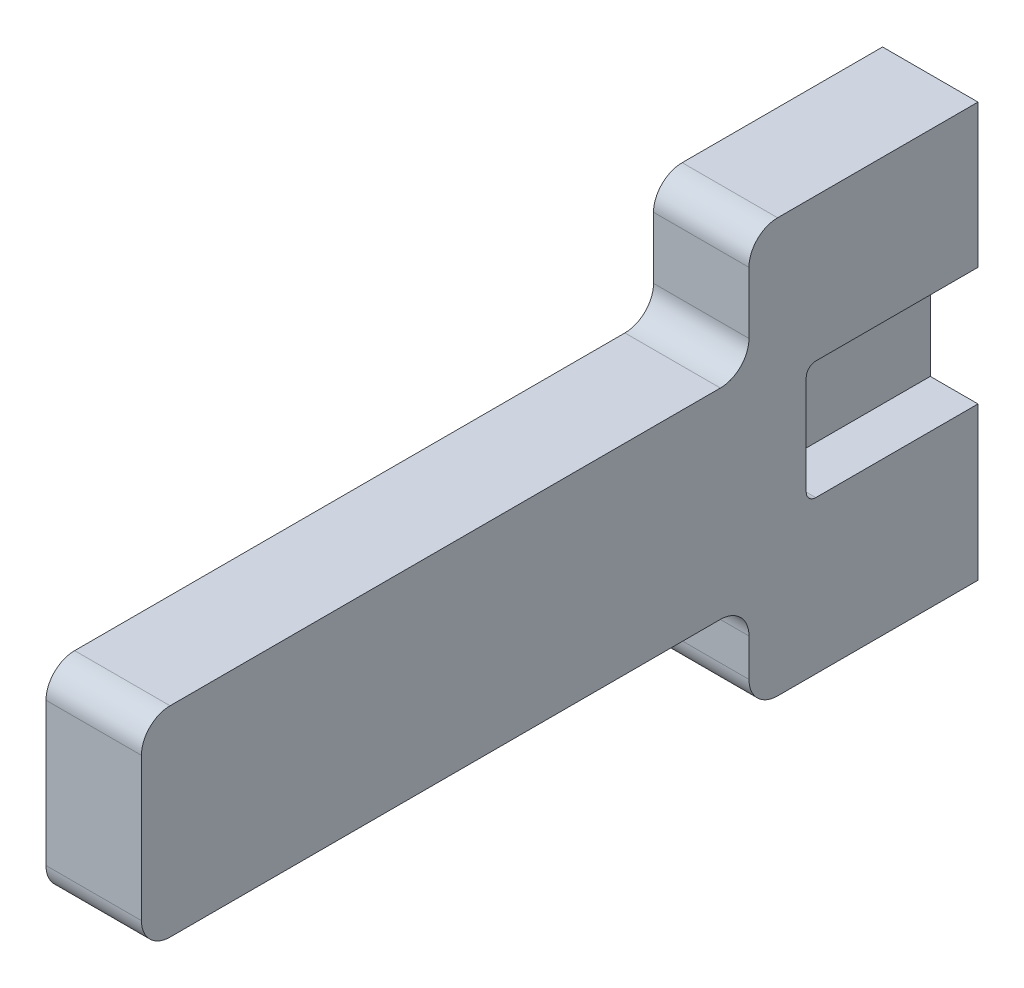
ISO-10303-21;
HEADER;
FILE_DESCRIPTION(('STEP AP214'),'2;1');
FILE_NAME('part.step','',(''),(''),'','','');
FILE_SCHEMA(('AUTOMOTIVE_DESIGN { 1 0 10303 214 1 1 1 1 }'));
ENDSEC;
DATA;
#1=APPLICATION_CONTEXT('core data for automotive mechanical design processes');
#2=APPLICATION_PROTOCOL_DEFINITION('international standard','automotive_design',2000,#1);
#3=PRODUCT_CONTEXT('',#1,'mechanical');
#4=PRODUCT('Part','Part','',(#3));
#5=PRODUCT_RELATED_PRODUCT_CATEGORY('part','',(#4));
#6=PRODUCT_DEFINITION_FORMATION('','',#4);
#7=PRODUCT_DEFINITION_CONTEXT('part definition',#1,'design');
#8=PRODUCT_DEFINITION('design','',#6,#7);
#9=PRODUCT_DEFINITION_SHAPE('','',#8);
#10=(LENGTH_UNIT() NAMED_UNIT(*) SI_UNIT(.MILLI.,.METRE.));
#11=(NAMED_UNIT(*) PLANE_ANGLE_UNIT() SI_UNIT($,.RADIAN.));
#12=(NAMED_UNIT(*) SI_UNIT($,.STERADIAN.) SOLID_ANGLE_UNIT());
#13=UNCERTAINTY_MEASURE_WITH_UNIT(LENGTH_MEASURE(1.E-05),#10,'distance_accuracy_value','');
#14=(GEOMETRIC_REPRESENTATION_CONTEXT(3) GLOBAL_UNCERTAINTY_ASSIGNED_CONTEXT((#13)) GLOBAL_UNIT_ASSIGNED_CONTEXT((#10,
#11,#12)) REPRESENTATION_CONTEXT('',''));
#15=CARTESIAN_POINT('',(0.,0.,0.));
#16=DIRECTION('',(0.,0.,1.));
#17=DIRECTION('',(1.,0.,0.));
#18=AXIS2_PLACEMENT_3D('',#15,#16,#17);
#19=CARTESIAN_POINT('',(10.,-10.2165086349905,0.));
#20=DIRECTION('',(0.,0.,1.));
#21=DIRECTION('',(1.,0.,0.));
#22=AXIS2_PLACEMENT_3D('',#19,#20,#21);
#23=PLANE('',#22);
#24=DIRECTION('',(0.,1.,0.));
#25=VECTOR('',#24,1.);
#26=CARTESIAN_POINT('',(5.,12.394708994709,0.));
#27=LINE('',#26,#25);
#28=CARTESIAN_POINT('',(5.,0.,0.));
#29=VERTEX_POINT('',#28);
#30=CARTESIAN_POINT('',(5.,12.394708994709,0.));
#31=VERTEX_POINT('',#30);
#32=EDGE_CURVE('E184',#29,#31,#27,.T.);
#33=ORIENTED_EDGE('',*,*,#32,.F.);
#34=DIRECTION('',(1.,0.,0.));
#35=VECTOR('',#34,1.);
#36=CARTESIAN_POINT('',(5.,0.,0.));
#37=LINE('',#36,#35);
#38=CARTESIAN_POINT('',(10.,0.,0.));
#39=VERTEX_POINT('',#38);
#40=EDGE_CURVE('E199',#29,#39,#37,.T.);
#41=ORIENTED_EDGE('',*,*,#40,.T.);
#42=DIRECTION('',(0.,1.,0.));
#43=VECTOR('',#42,1.);
#44=CARTESIAN_POINT('',(10.,-16.0028498087904,0.));
#45=LINE('',#44,#43);
#46=CARTESIAN_POINT('',(10.,-16.0028498087904,0.));
#47=VERTEX_POINT('',#46);
#48=EDGE_CURVE('E206',#47,#39,#45,.T.);
#49=ORIENTED_EDGE('',*,*,#48,.F.);
#50=DIRECTION('',(-1.,0.,0.));
#51=VECTOR('',#50,1.);
#52=CARTESIAN_POINT('',(10.,-16.0028498087904,0.));
#53=LINE('',#52,#51);
#54=CARTESIAN_POINT('',(0.,-16.0028498087904,0.));
#55=VERTEX_POINT('',#54);
#56=EDGE_CURVE('E227',#47,#55,#53,.T.);
#57=ORIENTED_EDGE('',*,*,#56,.T.);
#58=DIRECTION('',(0.,1.,0.));
#59=VECTOR('',#58,1.);
#60=CARTESIAN_POINT('',(0.,-10.2165086349905,0.));
#61=LINE('',#60,#59);
#62=CARTESIAN_POINT('',(0.,27.394708994709,0.));
#63=VERTEX_POINT('',#62);
#64=EDGE_CURVE('E201',#55,#63,#61,.T.);
#65=ORIENTED_EDGE('',*,*,#64,.T.);
#66=DIRECTION('',(-1.,0.,0.));
#67=VECTOR('',#66,1.);
#68=CARTESIAN_POINT('',(10.,27.394708994709,0.));
#69=LINE('',#68,#67);
#70=CARTESIAN_POINT('',(10.,27.394708994709,0.));
#71=VERTEX_POINT('',#70);
#72=EDGE_CURVE('E249',#71,#63,#69,.T.);
#73=ORIENTED_EDGE('',*,*,#72,.F.);
#74=CARTESIAN_POINT('',(10.,12.394708994709,0.));
#75=VERTEX_POINT('',#74);
#76=EDGE_CURVE('E198',#75,#71,#45,.T.);
#77=ORIENTED_EDGE('',*,*,#76,.F.);
#78=DIRECTION('',(1.,0.,0.));
#79=VECTOR('',#78,1.);
#80=CARTESIAN_POINT('',(5.,12.394708994709,0.));
#81=LINE('',#80,#79);
#82=EDGE_CURVE('E180',#31,#75,#81,.T.);
#83=ORIENTED_EDGE('',*,*,#82,.F.);
#84=EDGE_LOOP('',(#33,#41,#49,#57,#65,#73,#77,#83));
#85=FACE_BOUND('',#84,.T.);
#86=ADVANCED_FACE('F43',(#85),#23,.F.);
#87=CARTESIAN_POINT('',(10.,27.394708994709,0.));
#88=DIRECTION('',(0.,-1.,0.));
#89=DIRECTION('',(0.,0.,-1.));
#90=AXIS2_PLACEMENT_3D('',#87,#88,#89);
#91=PLANE('',#90);
#92=DIRECTION('',(0.,0.,1.));
#93=VECTOR('',#92,1.);
#94=CARTESIAN_POINT('',(0.,27.394708994709,0.));
#95=LINE('',#94,#93);
#96=CARTESIAN_POINT('',(0.,27.394708994709,21.));
#97=VERTEX_POINT('',#96);
#98=EDGE_CURVE('E229',#63,#97,#95,.T.);
#99=ORIENTED_EDGE('',*,*,#98,.T.);
#100=DIRECTION('',(-1.,0.,0.));
#101=VECTOR('',#100,1.);
#102=CARTESIAN_POINT('',(10.,27.394708994709,21.));
#103=LINE('',#102,#101);
#104=CARTESIAN_POINT('',(10.,27.394708994709,21.));
#105=VERTEX_POINT('',#104);
#106=EDGE_CURVE('E298',#97,#105,#103,.F.);
#107=ORIENTED_EDGE('',*,*,#106,.T.);
#108=DIRECTION('',(0.,0.,1.));
#109=VECTOR('',#108,1.);
#110=CARTESIAN_POINT('',(10.,27.394708994709,0.));
#111=LINE('',#110,#109);
#112=EDGE_CURVE('E209',#71,#105,#111,.T.);
#113=ORIENTED_EDGE('',*,*,#112,.F.);
#114=ORIENTED_EDGE('',*,*,#72,.T.);
#115=EDGE_LOOP('',(#99,#107,#113,#114));
#116=FACE_BOUND('',#115,.T.);
#117=ADVANCED_FACE('F352',(#116),#91,.F.);
#118=CARTESIAN_POINT('',(10.,27.394708994709,24.));
#119=DIRECTION('',(0.,0.,-1.));
#120=DIRECTION('',(0.,1.,0.));
#121=AXIS2_PLACEMENT_3D('',#118,#119,#120);
#122=PLANE('',#121);
#123=DIRECTION('',(0.,-1.,0.));
#124=VECTOR('',#123,1.);
#125=CARTESIAN_POINT('',(10.,27.394708994709,24.));
#126=LINE('',#125,#124);
#127=CARTESIAN_POINT('',(10.,24.394708994709,24.));
#128=VERTEX_POINT('',#127);
#129=CARTESIAN_POINT('',(10.,17.9424240836782,24.));
#130=VERTEX_POINT('',#129);
#131=EDGE_CURVE('E212',#128,#130,#126,.T.);
#132=ORIENTED_EDGE('',*,*,#131,.F.);
#133=DIRECTION('',(-1.,0.,0.));
#134=VECTOR('',#133,1.);
#135=CARTESIAN_POINT('',(10.,24.394708994709,24.));
#136=LINE('',#135,#134);
#137=CARTESIAN_POINT('',(0.,24.394708994709,24.));
#138=VERTEX_POINT('',#137);
#139=EDGE_CURVE('E295',#128,#138,#136,.T.);
#140=ORIENTED_EDGE('',*,*,#139,.T.);
#141=DIRECTION('',(0.,-1.,0.));
#142=VECTOR('',#141,1.);
#143=CARTESIAN_POINT('',(0.,27.394708994709,24.));
#144=LINE('',#143,#142);
#145=CARTESIAN_POINT('',(0.,17.9424240836782,24.));
#146=VERTEX_POINT('',#145);
#147=EDGE_CURVE('E232',#138,#146,#144,.T.);
#148=ORIENTED_EDGE('',*,*,#147,.T.);
#149=DIRECTION('',(-1.,0.,0.));
#150=VECTOR('',#149,1.);
#151=CARTESIAN_POINT('',(10.,17.9424240836782,24.));
#152=LINE('',#151,#150);
#153=EDGE_CURVE('E261',#146,#130,#152,.F.);
#154=ORIENTED_EDGE('',*,*,#153,.T.);
#155=EDGE_LOOP('',(#132,#140,#148,#154));
#156=FACE_BOUND('',#155,.T.);
#157=ADVANCED_FACE('F362',(#156),#122,.F.);
#158=CARTESIAN_POINT('',(10.,14.9424240836782,24.));
#159=DIRECTION('',(0.,-1.,0.));
#160=DIRECTION('',(0.,0.,-1.));
#161=AXIS2_PLACEMENT_3D('',#158,#159,#160);
#162=PLANE('',#161);
#163=DIRECTION('',(0.,0.,1.));
#164=VECTOR('',#163,1.);
#165=CARTESIAN_POINT('',(0.,14.9424240836782,24.));
#166=LINE('',#165,#164);
#167=CARTESIAN_POINT('',(0.,14.9424240836782,27.));
#168=VERTEX_POINT('',#167);
#169=CARTESIAN_POINT('',(0.,14.9424240836782,84.6638189462944));
#170=VERTEX_POINT('',#169);
#171=EDGE_CURVE('E234',#168,#170,#166,.T.);
#172=ORIENTED_EDGE('',*,*,#171,.T.);
#173=DIRECTION('',(-1.,0.,0.));
#174=VECTOR('',#173,1.);
#175=CARTESIAN_POINT('',(10.,14.9424240836782,84.6638189462944));
#176=LINE('',#175,#174);
#177=CARTESIAN_POINT('',(10.,14.9424240836782,84.6638189462944));
#178=VERTEX_POINT('',#177);
#179=EDGE_CURVE('E308',#170,#178,#176,.F.);
#180=ORIENTED_EDGE('',*,*,#179,.T.);
#181=DIRECTION('',(0.,0.,1.));
#182=VECTOR('',#181,1.);
#183=CARTESIAN_POINT('',(10.,14.9424240836782,24.));
#184=LINE('',#183,#182);
#185=CARTESIAN_POINT('',(10.,14.9424240836782,27.));
#186=VERTEX_POINT('',#185);
#187=EDGE_CURVE('E214',#186,#178,#184,.T.);
#188=ORIENTED_EDGE('',*,*,#187,.F.);
#189=DIRECTION('',(-1.,0.,0.));
#190=VECTOR('',#189,1.);
#191=CARTESIAN_POINT('',(0.,14.9424240836782,27.));
#192=LINE('',#191,#190);
#193=EDGE_CURVE('E258',#186,#168,#192,.T.);
#194=ORIENTED_EDGE('',*,*,#193,.T.);
#195=EDGE_LOOP('',(#172,#180,#188,#194));
#196=FACE_BOUND('',#195,.T.);
#197=ADVANCED_FACE('F429',(#196),#162,.F.);
#198=CARTESIAN_POINT('',(10.,14.9424240836782,87.6638189462944));
#199=DIRECTION('',(0.,0.,-1.));
#200=DIRECTION('',(-1.,0.,0.));
#201=AXIS2_PLACEMENT_3D('',#198,#199,#200);
#202=PLANE('',#201);
#203=DIRECTION('',(0.,-1.,0.));
#204=VECTOR('',#203,1.);
#205=CARTESIAN_POINT('',(0.,14.9424240836782,87.6638189462944));
#206=LINE('',#205,#204);
#207=CARTESIAN_POINT('',(0.,11.9424240836782,87.6638189462944));
#208=VERTEX_POINT('',#207);
#209=CARTESIAN_POINT('',(0.,-3.05757591632179,87.6638189462944));
#210=VERTEX_POINT('',#209);
#211=EDGE_CURVE('E237',#208,#210,#206,.T.);
#212=ORIENTED_EDGE('',*,*,#211,.T.);
#213=DIRECTION('',(-1.,0.,0.));
#214=VECTOR('',#213,1.);
#215=CARTESIAN_POINT('',(10.,-3.05757591632179,87.6638189462944));
#216=LINE('',#215,#214);
#217=CARTESIAN_POINT('',(10.,-3.05757591632179,87.6638189462944));
#218=VERTEX_POINT('',#217);
#219=EDGE_CURVE('E306',#210,#218,#216,.F.);
#220=ORIENTED_EDGE('',*,*,#219,.T.);
#221=DIRECTION('',(0.,-1.,0.));
#222=VECTOR('',#221,1.);
#223=CARTESIAN_POINT('',(10.,14.9424240836782,87.6638189462944));
#224=LINE('',#223,#222);
#225=CARTESIAN_POINT('',(10.,11.9424240836782,87.6638189462944));
#226=VERTEX_POINT('',#225);
#227=EDGE_CURVE('E217',#226,#218,#224,.T.);
#228=ORIENTED_EDGE('',*,*,#227,.F.);
#229=DIRECTION('',(-1.,0.,0.));
#230=VECTOR('',#229,1.);
#231=CARTESIAN_POINT('',(10.,11.9424240836782,87.6638189462944));
#232=LINE('',#231,#230);
#233=EDGE_CURVE('E303',#226,#208,#232,.T.);
#234=ORIENTED_EDGE('',*,*,#233,.T.);
#235=EDGE_LOOP('',(#212,#220,#228,#234));
#236=FACE_BOUND('',#235,.T.);
#237=ADVANCED_FACE('F411',(#236),#202,.F.);
#238=CARTESIAN_POINT('',(10.,-6.0575759163218,87.6638189462944));
#239=DIRECTION('',(0.,1.,0.));
#240=DIRECTION('',(0.,0.,1.));
#241=AXIS2_PLACEMENT_3D('',#238,#239,#240);
#242=PLANE('',#241);
#243=DIRECTION('',(0.,0.,-1.));
#244=VECTOR('',#243,1.);
#245=CARTESIAN_POINT('',(10.,-6.0575759163218,87.6638189462944));
#246=LINE('',#245,#244);
#247=CARTESIAN_POINT('',(10.,-6.0575759163218,84.6638189462944));
#248=VERTEX_POINT('',#247);
#249=CARTESIAN_POINT('',(10.,-6.0575759163218,27.));
#250=VERTEX_POINT('',#249);
#251=EDGE_CURVE('E220',#248,#250,#246,.T.);
#252=ORIENTED_EDGE('',*,*,#251,.F.);
#253=DIRECTION('',(-1.,0.,0.));
#254=VECTOR('',#253,1.);
#255=CARTESIAN_POINT('',(10.,-6.0575759163218,84.6638189462944));
#256=LINE('',#255,#254);
#257=CARTESIAN_POINT('',(0.,-6.0575759163218,84.6638189462944));
#258=VERTEX_POINT('',#257);
#259=EDGE_CURVE('E300',#248,#258,#256,.T.);
#260=ORIENTED_EDGE('',*,*,#259,.T.);
#261=DIRECTION('',(0.,0.,-1.));
#262=VECTOR('',#261,1.);
#263=CARTESIAN_POINT('',(0.,-6.0575759163218,87.6638189462944));
#264=LINE('',#263,#262);
#265=CARTESIAN_POINT('',(0.,-6.0575759163218,27.));
#266=VERTEX_POINT('',#265);
#267=EDGE_CURVE('E240',#258,#266,#264,.T.);
#268=ORIENTED_EDGE('',*,*,#267,.T.);
#269=DIRECTION('',(-1.,0.,0.));
#270=VECTOR('',#269,1.);
#271=CARTESIAN_POINT('',(10.,-6.0575759163218,27.));
#272=LINE('',#271,#270);
#273=EDGE_CURVE('E255',#266,#250,#272,.F.);
#274=ORIENTED_EDGE('',*,*,#273,.T.);
#275=EDGE_LOOP('',(#252,#260,#268,#274));
#276=FACE_BOUND('',#275,.T.);
#277=ADVANCED_FACE('F417',(#276),#242,.F.);
#278=CARTESIAN_POINT('',(10.,-6.0575759163218,24.));
#279=DIRECTION('',(0.,0.,-1.));
#280=DIRECTION('',(0.,1.,0.));
#281=AXIS2_PLACEMENT_3D('',#278,#279,#280);
#282=PLANE('',#281);
#283=DIRECTION('',(0.,-1.,0.));
#284=VECTOR('',#283,1.);
#285=CARTESIAN_POINT('',(0.,-6.0575759163218,24.));
#286=LINE('',#285,#284);
#287=CARTESIAN_POINT('',(0.,-9.05757591632179,24.));
#288=VERTEX_POINT('',#287);
#289=CARTESIAN_POINT('',(0.,-13.0028498087904,24.));
#290=VERTEX_POINT('',#289);
#291=EDGE_CURVE('E242',#288,#290,#286,.T.);
#292=ORIENTED_EDGE('',*,*,#291,.T.);
#293=DIRECTION('',(-1.,0.,0.));
#294=VECTOR('',#293,1.);
#295=CARTESIAN_POINT('',(10.,-13.0028498087904,24.));
#296=LINE('',#295,#294);
#297=CARTESIAN_POINT('',(10.,-13.0028498087904,24.));
#298=VERTEX_POINT('',#297);
#299=EDGE_CURVE('E285',#290,#298,#296,.F.);
#300=ORIENTED_EDGE('',*,*,#299,.T.);
#301=DIRECTION('',(0.,-1.,0.));
#302=VECTOR('',#301,1.);
#303=CARTESIAN_POINT('',(10.,-6.0575759163218,24.));
#304=LINE('',#303,#302);
#305=CARTESIAN_POINT('',(10.,-9.05757591632179,24.));
#306=VERTEX_POINT('',#305);
#307=EDGE_CURVE('E222',#306,#298,#304,.T.);
#308=ORIENTED_EDGE('',*,*,#307,.F.);
#309=DIRECTION('',(-1.,0.,0.));
#310=VECTOR('',#309,1.);
#311=CARTESIAN_POINT('',(0.,-9.05757591632179,24.));
#312=LINE('',#311,#310);
#313=EDGE_CURVE('E252',#306,#288,#312,.T.);
#314=ORIENTED_EDGE('',*,*,#313,.T.);
#315=EDGE_LOOP('',(#292,#300,#308,#314));
#316=FACE_BOUND('',#315,.T.);
#317=ADVANCED_FACE('F424',(#316),#282,.F.);
#318=CARTESIAN_POINT('',(10.,-16.0028498087904,24.));
#319=DIRECTION('',(0.,1.,0.));
#320=DIRECTION('',(0.,0.,1.));
#321=AXIS2_PLACEMENT_3D('',#318,#319,#320);
#322=PLANE('',#321);
#323=DIRECTION('',(0.,0.,-1.));
#324=VECTOR('',#323,1.);
#325=CARTESIAN_POINT('',(10.,-16.0028498087904,24.));
#326=LINE('',#325,#324);
#327=CARTESIAN_POINT('',(10.,-16.0028498087904,21.));
#328=VERTEX_POINT('',#327);
#329=EDGE_CURVE('E225',#328,#47,#326,.T.);
#330=ORIENTED_EDGE('',*,*,#329,.F.);
#331=DIRECTION('',(-1.,0.,0.));
#332=VECTOR('',#331,1.);
#333=CARTESIAN_POINT('',(10.,-16.0028498087904,21.));
#334=LINE('',#333,#332);
#335=CARTESIAN_POINT('',(0.,-16.0028498087904,21.));
#336=VERTEX_POINT('',#335);
#337=EDGE_CURVE('E274',#328,#336,#334,.T.);
#338=ORIENTED_EDGE('',*,*,#337,.T.);
#339=DIRECTION('',(0.,0.,-1.));
#340=VECTOR('',#339,1.);
#341=CARTESIAN_POINT('',(0.,-16.0028498087904,24.));
#342=LINE('',#341,#340);
#343=EDGE_CURVE('E245',#336,#55,#342,.T.);
#344=ORIENTED_EDGE('',*,*,#343,.T.);
#345=ORIENTED_EDGE('',*,*,#56,.F.);
#346=EDGE_LOOP('',(#330,#338,#344,#345));
#347=FACE_BOUND('',#346,.T.);
#348=ADVANCED_FACE('F345',(#347),#322,.F.);
#349=CARTESIAN_POINT('',(10.,0.,0.));
#350=DIRECTION('',(1.,0.,0.));
#351=DIRECTION('',(0.,0.,-1.));
#352=AXIS2_PLACEMENT_3D('',#349,#350,#351);
#353=PLANE('',#352);
#354=ORIENTED_EDGE('',*,*,#307,.T.);
#355=CARTESIAN_POINT('',(10.,-13.0028498087904,21.));
#356=DIRECTION('',(1.,0.,0.));
#357=DIRECTION('',(0.,0.,-1.));
#358=AXIS2_PLACEMENT_3D('',#355,#356,#357);
#359=CIRCLE('',#358,3.);
#360=EDGE_CURVE('E293',#298,#328,#359,.T.);
#361=ORIENTED_EDGE('',*,*,#360,.T.);
#362=ORIENTED_EDGE('',*,*,#329,.T.);
#363=ORIENTED_EDGE('',*,*,#48,.T.);
#364=DIRECTION('',(0.,0.,-1.));
#365=VECTOR('',#364,1.);
#366=CARTESIAN_POINT('',(10.,0.,0.));
#367=LINE('',#366,#365);
#368=CARTESIAN_POINT('',(10.,0.,17.));
#369=VERTEX_POINT('',#368);
#370=EDGE_CURVE('E194',#369,#39,#367,.T.);
#371=ORIENTED_EDGE('',*,*,#370,.F.);
#372=CARTESIAN_POINT('',(10.,0.999999999999998,17.));
#373=DIRECTION('',(1.,0.,0.));
#374=DIRECTION('',(0.,0.,-1.));
#375=AXIS2_PLACEMENT_3D('',#372,#373,#374);
#376=CIRCLE('',#375,1.);
#377=CARTESIAN_POINT('',(10.,0.999999999999997,18.));
#378=VERTEX_POINT('',#377);
#379=EDGE_CURVE('E51',#369,#378,#376,.F.);
#380=ORIENTED_EDGE('',*,*,#379,.T.);
#381=DIRECTION('',(0.,-1.,0.));
#382=VECTOR('',#381,1.);
#383=CARTESIAN_POINT('',(10.,0.,18.));
#384=LINE('',#383,#382);
#385=CARTESIAN_POINT('',(10.,11.394708994709,18.));
#386=VERTEX_POINT('',#385);
#387=EDGE_CURVE('E325',#386,#378,#384,.T.);
#388=ORIENTED_EDGE('',*,*,#387,.F.);
#389=CARTESIAN_POINT('',(10.,11.394708994709,17.));
#390=DIRECTION('',(1.,0.,0.));
#391=DIRECTION('',(0.,0.,-1.));
#392=AXIS2_PLACEMENT_3D('',#389,#390,#391);
#393=CIRCLE('',#392,1.);
#394=CARTESIAN_POINT('',(10.,12.394708994709,17.));
#395=VERTEX_POINT('',#394);
#396=EDGE_CURVE('E11',#386,#395,#393,.F.);
#397=ORIENTED_EDGE('',*,*,#396,.T.);
#398=DIRECTION('',(0.,0.,1.));
#399=VECTOR('',#398,1.);
#400=CARTESIAN_POINT('',(10.,12.394708994709,18.));
#401=LINE('',#400,#399);
#402=EDGE_CURVE('E333',#75,#395,#401,.T.);
#403=ORIENTED_EDGE('',*,*,#402,.F.);
#404=ORIENTED_EDGE('',*,*,#76,.T.);
#405=ORIENTED_EDGE('',*,*,#112,.T.);
#406=CARTESIAN_POINT('',(10.,24.394708994709,21.));
#407=DIRECTION('',(1.,0.,0.));
#408=DIRECTION('',(0.,0.,-1.));
#409=AXIS2_PLACEMENT_3D('',#406,#407,#408);
#410=CIRCLE('',#409,3.);
#411=EDGE_CURVE('E291',#105,#128,#410,.T.);
#412=ORIENTED_EDGE('',*,*,#411,.T.);
#413=ORIENTED_EDGE('',*,*,#131,.T.);
#414=CARTESIAN_POINT('',(10.,17.9424240836782,27.));
#415=DIRECTION('',(1.,0.,0.));
#416=DIRECTION('',(0.,0.,-1.));
#417=AXIS2_PLACEMENT_3D('',#414,#415,#416);
#418=CIRCLE('',#417,3.);
#419=EDGE_CURVE('E272',#130,#186,#418,.F.);
#420=ORIENTED_EDGE('',*,*,#419,.T.);
#421=ORIENTED_EDGE('',*,*,#187,.T.);
#422=CARTESIAN_POINT('',(10.,11.9424240836782,84.6638189462944));
#423=DIRECTION('',(1.,0.,0.));
#424=DIRECTION('',(0.,0.,-1.));
#425=AXIS2_PLACEMENT_3D('',#422,#423,#424);
#426=CIRCLE('',#425,3.);
#427=EDGE_CURVE('E287',#178,#226,#426,.T.);
#428=ORIENTED_EDGE('',*,*,#427,.T.);
#429=ORIENTED_EDGE('',*,*,#227,.T.);
#430=CARTESIAN_POINT('',(10.,-3.0575759163218,84.6638189462944));
#431=DIRECTION('',(1.,0.,0.));
#432=DIRECTION('',(0.,0.,-1.));
#433=AXIS2_PLACEMENT_3D('',#430,#431,#432);
#434=CIRCLE('',#433,3.);
#435=EDGE_CURVE('E289',#218,#248,#434,.T.);
#436=ORIENTED_EDGE('',*,*,#435,.T.);
#437=ORIENTED_EDGE('',*,*,#251,.T.);
#438=CARTESIAN_POINT('',(10.,-9.0575759163218,27.));
#439=DIRECTION('',(1.,0.,0.));
#440=DIRECTION('',(0.,0.,-1.));
#441=AXIS2_PLACEMENT_3D('',#438,#439,#440);
#442=CIRCLE('',#441,3.);
#443=EDGE_CURVE('E267',#250,#306,#442,.F.);
#444=ORIENTED_EDGE('',*,*,#443,.T.);
#445=EDGE_LOOP('',(#354,#361,#362,#363,#371,#380,#388,#397,#403,#404,#405,#412,#413,#420,#421,
#428,#429,#436,#437,#444));
#446=FACE_BOUND('',#445,.T.);
#447=ADVANCED_FACE('F324',(#446),#353,.T.);
#448=CARTESIAN_POINT('',(0.,0.,0.));
#449=DIRECTION('',(1.,0.,0.));
#450=DIRECTION('',(0.,0.,-1.));
#451=AXIS2_PLACEMENT_3D('',#448,#449,#450);
#452=PLANE('',#451);
#453=ORIENTED_EDGE('',*,*,#343,.F.);
#454=CARTESIAN_POINT('',(0.,-13.0028498087904,21.));
#455=DIRECTION('',(1.,0.,0.));
#456=DIRECTION('',(0.,0.,-1.));
#457=AXIS2_PLACEMENT_3D('',#454,#455,#456);
#458=CIRCLE('',#457,3.);
#459=EDGE_CURVE('E283',#336,#290,#458,.F.);
#460=ORIENTED_EDGE('',*,*,#459,.T.);
#461=ORIENTED_EDGE('',*,*,#291,.F.);
#462=CARTESIAN_POINT('',(0.,-9.0575759163218,27.));
#463=DIRECTION('',(1.,0.,0.));
#464=DIRECTION('',(0.,0.,-1.));
#465=AXIS2_PLACEMENT_3D('',#462,#463,#464);
#466=CIRCLE('',#465,3.);
#467=EDGE_CURVE('E264',#288,#266,#466,.T.);
#468=ORIENTED_EDGE('',*,*,#467,.T.);
#469=ORIENTED_EDGE('',*,*,#267,.F.);
#470=CARTESIAN_POINT('',(0.,-3.0575759163218,84.6638189462944));
#471=DIRECTION('',(1.,0.,0.));
#472=DIRECTION('',(0.,0.,-1.));
#473=AXIS2_PLACEMENT_3D('',#470,#471,#472);
#474=CIRCLE('',#473,3.);
#475=EDGE_CURVE('E279',#258,#210,#474,.F.);
#476=ORIENTED_EDGE('',*,*,#475,.T.);
#477=ORIENTED_EDGE('',*,*,#211,.F.);
#478=CARTESIAN_POINT('',(0.,11.9424240836782,84.6638189462944));
#479=DIRECTION('',(1.,0.,0.));
#480=DIRECTION('',(0.,0.,-1.));
#481=AXIS2_PLACEMENT_3D('',#478,#479,#480);
#482=CIRCLE('',#481,3.);
#483=EDGE_CURVE('E277',#208,#170,#482,.F.);
#484=ORIENTED_EDGE('',*,*,#483,.T.);
#485=ORIENTED_EDGE('',*,*,#171,.F.);
#486=CARTESIAN_POINT('',(0.,17.9424240836782,27.));
#487=DIRECTION('',(1.,0.,0.));
#488=DIRECTION('',(0.,0.,-1.));
#489=AXIS2_PLACEMENT_3D('',#486,#487,#488);
#490=CIRCLE('',#489,3.);
#491=EDGE_CURVE('E269',#168,#146,#490,.T.);
#492=ORIENTED_EDGE('',*,*,#491,.T.);
#493=ORIENTED_EDGE('',*,*,#147,.F.);
#494=CARTESIAN_POINT('',(0.,24.394708994709,21.));
#495=DIRECTION('',(1.,0.,0.));
#496=DIRECTION('',(0.,0.,-1.));
#497=AXIS2_PLACEMENT_3D('',#494,#495,#496);
#498=CIRCLE('',#497,3.);
#499=EDGE_CURVE('E281',#138,#97,#498,.F.);
#500=ORIENTED_EDGE('',*,*,#499,.T.);
#501=ORIENTED_EDGE('',*,*,#98,.F.);
#502=ORIENTED_EDGE('',*,*,#64,.F.);
#503=EDGE_LOOP('',(#453,#460,#461,#468,#469,#476,#477,#484,#485,#492,#493,#500,#501,#502));
#504=FACE_BOUND('',#503,.T.);
#505=ADVANCED_FACE('F354',(#504),#452,.F.);
#506=CARTESIAN_POINT('',(5.,0.,0.));
#507=DIRECTION('',(0.,-1.,0.));
#508=DIRECTION('',(0.,0.,-1.));
#509=AXIS2_PLACEMENT_3D('',#506,#507,#508);
#510=PLANE('',#509);
#511=DIRECTION('',(0.,0.,-1.));
#512=VECTOR('',#511,1.);
#513=CARTESIAN_POINT('',(5.,0.,0.));
#514=LINE('',#513,#512);
#515=CARTESIAN_POINT('',(5.,0.,17.));
#516=VERTEX_POINT('',#515);
#517=EDGE_CURVE('E190',#516,#29,#514,.T.);
#518=ORIENTED_EDGE('',*,*,#517,.F.);
#519=DIRECTION('',(1.,0.,0.));
#520=VECTOR('',#519,1.);
#521=CARTESIAN_POINT('',(10.,0.,17.));
#522=LINE('',#521,#520);
#523=EDGE_CURVE('E310',#516,#369,#522,.T.);
#524=ORIENTED_EDGE('',*,*,#523,.T.);
#525=ORIENTED_EDGE('',*,*,#370,.T.);
#526=ORIENTED_EDGE('',*,*,#40,.F.);
#527=EDGE_LOOP('',(#518,#524,#525,#526));
#528=FACE_BOUND('',#527,.T.);
#529=ADVANCED_FACE('F338',(#528),#510,.F.);
#530=CARTESIAN_POINT('',(5.,0.,18.));
#531=DIRECTION('',(0.,0.,1.));
#532=DIRECTION('',(1.,0.,0.));
#533=AXIS2_PLACEMENT_3D('',#530,#531,#532);
#534=PLANE('',#533);
#535=ORIENTED_EDGE('',*,*,#387,.T.);
#536=DIRECTION('',(1.,0.,0.));
#537=VECTOR('',#536,1.);
#538=CARTESIAN_POINT('',(5.,0.999999999999998,18.));
#539=LINE('',#538,#537);
#540=CARTESIAN_POINT('',(5.,0.999999999999997,18.));
#541=VERTEX_POINT('',#540);
#542=EDGE_CURVE('E316',#378,#541,#539,.F.);
#543=ORIENTED_EDGE('',*,*,#542,.T.);
#544=DIRECTION('',(0.,-1.,0.));
#545=VECTOR('',#544,1.);
#546=CARTESIAN_POINT('',(5.,0.,18.));
#547=LINE('',#546,#545);
#548=CARTESIAN_POINT('',(5.,11.394708994709,18.));
#549=VERTEX_POINT('',#548);
#550=EDGE_CURVE('E183',#549,#541,#547,.T.);
#551=ORIENTED_EDGE('',*,*,#550,.F.);
#552=DIRECTION('',(1.,0.,0.));
#553=VECTOR('',#552,1.);
#554=CARTESIAN_POINT('',(10.,11.394708994709,18.));
#555=LINE('',#554,#553);
#556=EDGE_CURVE('E313',#549,#386,#555,.T.);
#557=ORIENTED_EDGE('',*,*,#556,.T.);
#558=EDGE_LOOP('',(#535,#543,#551,#557));
#559=FACE_BOUND('',#558,.T.);
#560=ADVANCED_FACE('F330',(#559),#534,.F.);
#561=CARTESIAN_POINT('',(5.,12.394708994709,18.));
#562=DIRECTION('',(0.,1.,0.));
#563=DIRECTION('',(0.,0.,1.));
#564=AXIS2_PLACEMENT_3D('',#561,#562,#563);
#565=PLANE('',#564);
#566=ORIENTED_EDGE('',*,*,#402,.T.);
#567=DIRECTION('',(1.,0.,0.));
#568=VECTOR('',#567,1.);
#569=CARTESIAN_POINT('',(5.,12.394708994709,17.));
#570=LINE('',#569,#568);
#571=CARTESIAN_POINT('',(5.,12.394708994709,17.));
#572=VERTEX_POINT('',#571);
#573=EDGE_CURVE('E63',#395,#572,#570,.F.);
#574=ORIENTED_EDGE('',*,*,#573,.T.);
#575=DIRECTION('',(0.,0.,1.));
#576=VECTOR('',#575,1.);
#577=CARTESIAN_POINT('',(5.,12.394708994709,18.));
#578=LINE('',#577,#576);
#579=EDGE_CURVE('E176',#31,#572,#578,.T.);
#580=ORIENTED_EDGE('',*,*,#579,.F.);
#581=ORIENTED_EDGE('',*,*,#82,.T.);
#582=EDGE_LOOP('',(#566,#574,#580,#581));
#583=FACE_BOUND('',#582,.T.);
#584=ADVANCED_FACE('F178',(#583),#565,.F.);
#585=CARTESIAN_POINT('',(5.,0.,0.));
#586=DIRECTION('',(-1.,0.,0.));
#587=DIRECTION('',(0.,0.,1.));
#588=AXIS2_PLACEMENT_3D('',#585,#586,#587);
#589=PLANE('',#588);
#590=ORIENTED_EDGE('',*,*,#550,.T.);
#591=CARTESIAN_POINT('',(5.,0.999999999999998,17.));
#592=DIRECTION('',(-1.,0.,0.));
#593=DIRECTION('',(0.,0.,1.));
#594=AXIS2_PLACEMENT_3D('',#591,#592,#593);
#595=CIRCLE('',#594,1.);
#596=EDGE_CURVE('E320',#541,#516,#595,.F.);
#597=ORIENTED_EDGE('',*,*,#596,.T.);
#598=ORIENTED_EDGE('',*,*,#517,.T.);
#599=ORIENTED_EDGE('',*,*,#32,.T.);
#600=ORIENTED_EDGE('',*,*,#579,.T.);
#601=CARTESIAN_POINT('',(5.,11.394708994709,17.));
#602=DIRECTION('',(-1.,0.,0.));
#603=DIRECTION('',(0.,0.,1.));
#604=AXIS2_PLACEMENT_3D('',#601,#602,#603);
#605=CIRCLE('',#604,1.);
#606=EDGE_CURVE('E318',#572,#549,#605,.F.);
#607=ORIENTED_EDGE('',*,*,#606,.T.);
#608=EDGE_LOOP('',(#590,#597,#598,#599,#600,#607));
#609=FACE_BOUND('',#608,.T.);
#610=ADVANCED_FACE('F188',(#609),#589,.F.);
#611=CARTESIAN_POINT('',(10.,-9.0575759163218,27.));
#612=DIRECTION('',(1.,0.,0.));
#613=DIRECTION('',(0.,0.,-1.));
#614=AXIS2_PLACEMENT_3D('',#611,#612,#613);
#615=CYLINDRICAL_SURFACE('',#614,3.);
#616=ORIENTED_EDGE('',*,*,#443,.F.);
#617=ORIENTED_EDGE('',*,*,#273,.F.);
#618=ORIENTED_EDGE('',*,*,#467,.F.);
#619=ORIENTED_EDGE('',*,*,#313,.F.);
#620=EDGE_LOOP('',(#616,#617,#618,#619));
#621=FACE_BOUND('',#620,.T.);
#622=ADVANCED_FACE('F383',(#621),#615,.F.);
#623=CARTESIAN_POINT('',(10.,17.9424240836782,27.));
#624=DIRECTION('',(1.,0.,0.));
#625=DIRECTION('',(0.,0.,-1.));
#626=AXIS2_PLACEMENT_3D('',#623,#624,#625);
#627=CYLINDRICAL_SURFACE('',#626,3.);
#628=ORIENTED_EDGE('',*,*,#419,.F.);
#629=ORIENTED_EDGE('',*,*,#153,.F.);
#630=ORIENTED_EDGE('',*,*,#491,.F.);
#631=ORIENTED_EDGE('',*,*,#193,.F.);
#632=EDGE_LOOP('',(#628,#629,#630,#631));
#633=FACE_BOUND('',#632,.T.);
#634=ADVANCED_FACE('F385',(#633),#627,.F.);
#635=CARTESIAN_POINT('',(10.,-13.0028498087904,21.));
#636=DIRECTION('',(-1.,0.,0.));
#637=DIRECTION('',(0.,0.,1.));
#638=AXIS2_PLACEMENT_3D('',#635,#636,#637);
#639=CYLINDRICAL_SURFACE('',#638,3.);
#640=ORIENTED_EDGE('',*,*,#360,.F.);
#641=ORIENTED_EDGE('',*,*,#299,.F.);
#642=ORIENTED_EDGE('',*,*,#459,.F.);
#643=ORIENTED_EDGE('',*,*,#337,.F.);
#644=EDGE_LOOP('',(#640,#641,#642,#643));
#645=FACE_BOUND('',#644,.T.);
#646=ADVANCED_FACE('F389',(#645),#639,.T.);
#647=CARTESIAN_POINT('',(10.,24.394708994709,21.));
#648=DIRECTION('',(-1.,0.,0.));
#649=DIRECTION('',(0.,0.,1.));
#650=AXIS2_PLACEMENT_3D('',#647,#648,#649);
#651=CYLINDRICAL_SURFACE('',#650,3.);
#652=ORIENTED_EDGE('',*,*,#411,.F.);
#653=ORIENTED_EDGE('',*,*,#106,.F.);
#654=ORIENTED_EDGE('',*,*,#499,.F.);
#655=ORIENTED_EDGE('',*,*,#139,.F.);
#656=EDGE_LOOP('',(#652,#653,#654,#655));
#657=FACE_BOUND('',#656,.T.);
#658=ADVANCED_FACE('F359',(#657),#651,.T.);
#659=CARTESIAN_POINT('',(10.,-3.0575759163218,84.6638189462944));
#660=DIRECTION('',(-1.,0.,0.));
#661=DIRECTION('',(0.,0.,1.));
#662=AXIS2_PLACEMENT_3D('',#659,#660,#661);
#663=CYLINDRICAL_SURFACE('',#662,3.);
#664=ORIENTED_EDGE('',*,*,#435,.F.);
#665=ORIENTED_EDGE('',*,*,#219,.F.);
#666=ORIENTED_EDGE('',*,*,#475,.F.);
#667=ORIENTED_EDGE('',*,*,#259,.F.);
#668=EDGE_LOOP('',(#664,#665,#666,#667));
#669=FACE_BOUND('',#668,.T.);
#670=ADVANCED_FACE('F396',(#669),#663,.T.);
#671=CARTESIAN_POINT('',(10.,11.9424240836782,84.6638189462944));
#672=DIRECTION('',(-1.,0.,0.));
#673=DIRECTION('',(0.,0.,1.));
#674=AXIS2_PLACEMENT_3D('',#671,#672,#673);
#675=CYLINDRICAL_SURFACE('',#674,3.);
#676=ORIENTED_EDGE('',*,*,#427,.F.);
#677=ORIENTED_EDGE('',*,*,#179,.F.);
#678=ORIENTED_EDGE('',*,*,#483,.F.);
#679=ORIENTED_EDGE('',*,*,#233,.F.);
#680=EDGE_LOOP('',(#676,#677,#678,#679));
#681=FACE_BOUND('',#680,.T.);
#682=ADVANCED_FACE('F373',(#681),#675,.T.);
#683=CARTESIAN_POINT('',(5.,0.999999999999998,17.));
#684=DIRECTION('',(-1.,0.,0.));
#685=DIRECTION('',(0.,0.,1.));
#686=AXIS2_PLACEMENT_3D('',#683,#684,#685);
#687=CYLINDRICAL_SURFACE('',#686,1.);
#688=ORIENTED_EDGE('',*,*,#596,.F.);
#689=ORIENTED_EDGE('',*,*,#542,.F.);
#690=ORIENTED_EDGE('',*,*,#379,.F.);
#691=ORIENTED_EDGE('',*,*,#523,.F.);
#692=EDGE_LOOP('',(#688,#689,#690,#691));
#693=FACE_BOUND('',#692,.T.);
#694=ADVANCED_FACE('F336',(#693),#687,.F.);
#695=CARTESIAN_POINT('',(5.,11.394708994709,17.));
#696=DIRECTION('',(-1.,0.,0.));
#697=DIRECTION('',(0.,0.,1.));
#698=AXIS2_PLACEMENT_3D('',#695,#696,#697);
#699=CYLINDRICAL_SURFACE('',#698,1.);
#700=ORIENTED_EDGE('',*,*,#606,.F.);
#701=ORIENTED_EDGE('',*,*,#573,.F.);
#702=ORIENTED_EDGE('',*,*,#396,.F.);
#703=ORIENTED_EDGE('',*,*,#556,.F.);
#704=EDGE_LOOP('',(#700,#701,#702,#703));
#705=FACE_BOUND('',#704,.T.);
#706=ADVANCED_FACE('F45',(#705),#699,.F.);
#707=CLOSED_SHELL('',(#86,#117,#157,#197,#237,#277,#317,#348,#447,#505,#529,#560,#584,#610,#622,
#634,#646,#658,#670,#682,#694,#706));
#708=MANIFOLD_SOLID_BREP('B2',#707);
#709=ADVANCED_BREP_SHAPE_REPRESENTATION('',(#18,#708),#14);
#710=SHAPE_DEFINITION_REPRESENTATION(#9,#709);
ENDSEC;
END-ISO-10303-21;
